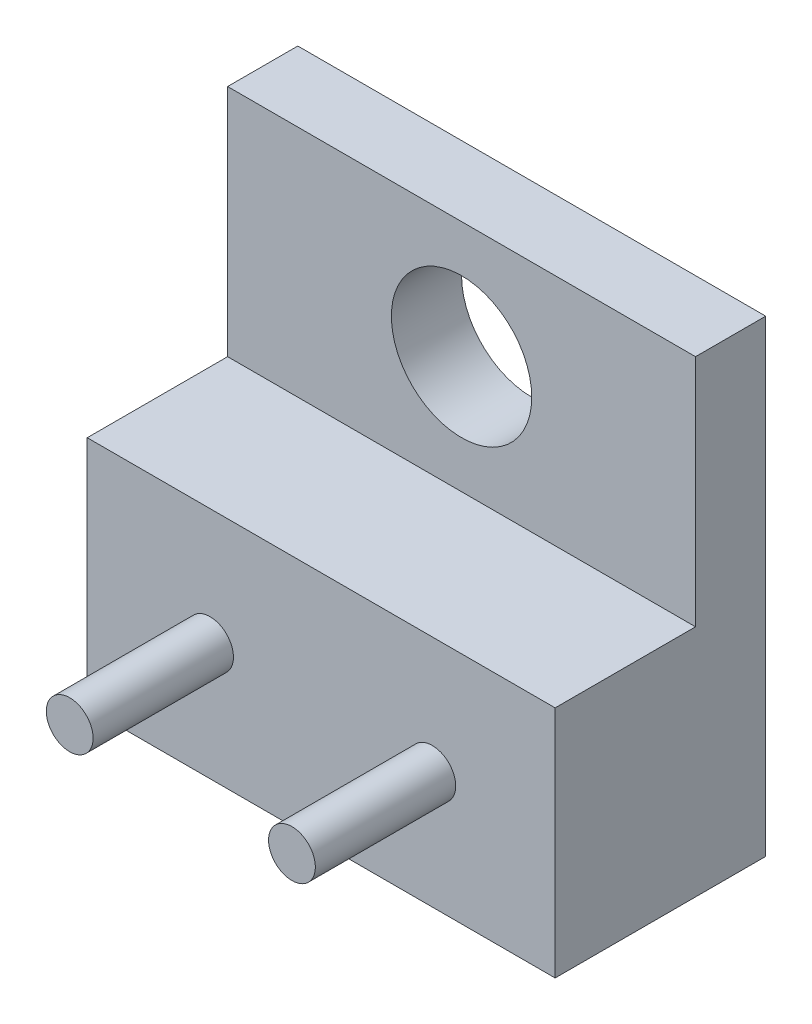
ISO-10303-21;
HEADER;
FILE_DESCRIPTION(('STEP AP214'),'2;1');
FILE_NAME('part.step','',(''),(''),'','','');
FILE_SCHEMA(('AUTOMOTIVE_DESIGN { 1 0 10303 214 1 1 1 1 }'));
ENDSEC;
DATA;
#1=APPLICATION_CONTEXT('core data for automotive mechanical design processes');
#2=APPLICATION_PROTOCOL_DEFINITION('international standard','automotive_design',2000,#1);
#3=PRODUCT_CONTEXT('',#1,'mechanical');
#4=PRODUCT('Part','Part','',(#3));
#5=PRODUCT_RELATED_PRODUCT_CATEGORY('part','',(#4));
#6=PRODUCT_DEFINITION_FORMATION('','',#4);
#7=PRODUCT_DEFINITION_CONTEXT('part definition',#1,'design');
#8=PRODUCT_DEFINITION('design','',#6,#7);
#9=PRODUCT_DEFINITION_SHAPE('','',#8);
#10=(LENGTH_UNIT() NAMED_UNIT(*) SI_UNIT(.MILLI.,.METRE.));
#11=(NAMED_UNIT(*) PLANE_ANGLE_UNIT() SI_UNIT($,.RADIAN.));
#12=(NAMED_UNIT(*) SI_UNIT($,.STERADIAN.) SOLID_ANGLE_UNIT());
#13=UNCERTAINTY_MEASURE_WITH_UNIT(LENGTH_MEASURE(1.E-05),#10,'distance_accuracy_value','');
#14=(GEOMETRIC_REPRESENTATION_CONTEXT(3) GLOBAL_UNCERTAINTY_ASSIGNED_CONTEXT((#13)) GLOBAL_UNIT_ASSIGNED_CONTEXT((#10,
#11,#12)) REPRESENTATION_CONTEXT('',''));
#15=CARTESIAN_POINT('',(0.,0.,0.));
#16=DIRECTION('',(0.,0.,1.));
#17=DIRECTION('',(1.,0.,0.));
#18=AXIS2_PLACEMENT_3D('',#15,#16,#17);
#19=CARTESIAN_POINT('',(0.,20.,9.));
#20=DIRECTION('',(0.,-1.,0.));
#21=DIRECTION('',(0.,0.,-1.));
#22=AXIS2_PLACEMENT_3D('',#19,#20,#21);
#23=PLANE('',#22);
#24=DIRECTION('',(-1.,0.,0.));
#25=VECTOR('',#24,1.);
#26=CARTESIAN_POINT('',(0.,20.,3.));
#27=LINE('',#26,#25);
#28=CARTESIAN_POINT('',(20.,20.,3.));
#29=VERTEX_POINT('',#28);
#30=CARTESIAN_POINT('',(0.,20.,3.));
#31=VERTEX_POINT('',#30);
#32=EDGE_CURVE('E174',#29,#31,#27,.T.);
#33=ORIENTED_EDGE('',*,*,#32,.F.);
#34=DIRECTION('',(0.,0.,-1.));
#35=VECTOR('',#34,1.);
#36=CARTESIAN_POINT('',(20.,20.,9.));
#37=LINE('',#36,#35);
#38=CARTESIAN_POINT('',(20.,20.,0.));
#39=VERTEX_POINT('',#38);
#40=EDGE_CURVE('E89',#29,#39,#37,.T.);
#41=ORIENTED_EDGE('',*,*,#40,.T.);
#42=DIRECTION('',(-1.,0.,0.));
#43=VECTOR('',#42,1.);
#44=CARTESIAN_POINT('',(0.,20.,0.));
#45=LINE('',#44,#43);
#46=CARTESIAN_POINT('',(0.,20.,0.));
#47=VERTEX_POINT('',#46);
#48=EDGE_CURVE('E93',#39,#47,#45,.T.);
#49=ORIENTED_EDGE('',*,*,#48,.T.);
#50=DIRECTION('',(0.,0.,-1.));
#51=VECTOR('',#50,1.);
#52=CARTESIAN_POINT('',(0.,20.,9.));
#53=LINE('',#52,#51);
#54=EDGE_CURVE('E79',#31,#47,#53,.T.);
#55=ORIENTED_EDGE('',*,*,#54,.F.);
#56=EDGE_LOOP('',(#33,#41,#49,#55));
#57=FACE_BOUND('',#56,.T.);
#58=ADVANCED_FACE('F35',(#57),#23,.F.);
#59=CARTESIAN_POINT('',(0.,0.,9.));
#60=DIRECTION('',(0.,0.,-1.));
#61=DIRECTION('',(-1.,0.,0.));
#62=AXIS2_PLACEMENT_3D('',#59,#60,#61);
#63=PLANE('',#62);
#64=CARTESIAN_POINT('',(5.25,5.,9.));
#65=DIRECTION('',(0.,0.,-1.));
#66=DIRECTION('',(-1.,0.,0.));
#67=AXIS2_PLACEMENT_3D('',#64,#65,#66);
#68=CIRCLE('',#67,1.);
#69=CARTESIAN_POINT('',(4.25,5.,9.));
#70=VERTEX_POINT('',#69);
#71=EDGE_CURVE('E43',#70,#70,#68,.F.);
#72=ORIENTED_EDGE('',*,*,#71,.F.);
#73=EDGE_LOOP('',(#72));
#74=FACE_BOUND('',#73,.T.);
#75=DIRECTION('',(0.,1.,0.));
#76=VECTOR('',#75,1.);
#77=CARTESIAN_POINT('',(20.,0.,9.));
#78=LINE('',#77,#76);
#79=CARTESIAN_POINT('',(20.,0.,9.));
#80=VERTEX_POINT('',#79);
#81=CARTESIAN_POINT('',(20.,10.,9.));
#82=VERTEX_POINT('',#81);
#83=EDGE_CURVE('E90',#80,#82,#78,.T.);
#84=ORIENTED_EDGE('',*,*,#83,.T.);
#85=DIRECTION('',(1.,0.,0.));
#86=VECTOR('',#85,1.);
#87=CARTESIAN_POINT('',(0.,10.,9.));
#88=LINE('',#87,#86);
#89=CARTESIAN_POINT('',(0.,10.,9.));
#90=VERTEX_POINT('',#89);
#91=EDGE_CURVE('E176',#90,#82,#88,.T.);
#92=ORIENTED_EDGE('',*,*,#91,.F.);
#93=DIRECTION('',(0.,-1.,0.));
#94=VECTOR('',#93,1.);
#95=CARTESIAN_POINT('',(0.,0.,9.));
#96=LINE('',#95,#94);
#97=CARTESIAN_POINT('',(0.,0.,9.));
#98=VERTEX_POINT('',#97);
#99=EDGE_CURVE('E98',#90,#98,#96,.T.);
#100=ORIENTED_EDGE('',*,*,#99,.T.);
#101=DIRECTION('',(1.,0.,0.));
#102=VECTOR('',#101,1.);
#103=CARTESIAN_POINT('',(0.,0.,9.));
#104=LINE('',#103,#102);
#105=EDGE_CURVE('E59',#98,#80,#104,.T.);
#106=ORIENTED_EDGE('',*,*,#105,.T.);
#107=EDGE_LOOP('',(#84,#92,#100,#106));
#108=FACE_BOUND('',#107,.T.);
#109=CARTESIAN_POINT('',(14.7499811048834,4.98105252368126,9.));
#110=DIRECTION('',(0.,0.,-1.));
#111=DIRECTION('',(-1.,0.,0.));
#112=AXIS2_PLACEMENT_3D('',#109,#110,#111);
#113=CIRCLE('',#112,1.);
#114=CARTESIAN_POINT('',(13.7499811048834,4.98105252368126,9.));
#115=VERTEX_POINT('',#114);
#116=EDGE_CURVE('E11',#115,#115,#113,.F.);
#117=ORIENTED_EDGE('',*,*,#116,.F.);
#118=EDGE_LOOP('',(#117));
#119=FACE_BOUND('',#118,.T.);
#120=ADVANCED_FACE('F124',(#74,#108,#119),#63,.F.);
#121=CARTESIAN_POINT('',(0.,0.,9.));
#122=DIRECTION('',(1.,0.,0.));
#123=DIRECTION('',(0.,0.,-1.));
#124=AXIS2_PLACEMENT_3D('',#121,#122,#123);
#125=PLANE('',#124);
#126=ORIENTED_EDGE('',*,*,#99,.F.);
#127=DIRECTION('',(0.,0.,1.));
#128=VECTOR('',#127,1.);
#129=CARTESIAN_POINT('',(0.,10.,3.));
#130=LINE('',#129,#128);
#131=CARTESIAN_POINT('',(0.,10.,3.));
#132=VERTEX_POINT('',#131);
#133=EDGE_CURVE('E171',#132,#90,#130,.T.);
#134=ORIENTED_EDGE('',*,*,#133,.F.);
#135=DIRECTION('',(0.,-1.,0.));
#136=VECTOR('',#135,1.);
#137=CARTESIAN_POINT('',(0.,20.,3.));
#138=LINE('',#137,#136);
#139=EDGE_CURVE('E87',#31,#132,#138,.T.);
#140=ORIENTED_EDGE('',*,*,#139,.F.);
#141=ORIENTED_EDGE('',*,*,#54,.T.);
#142=DIRECTION('',(0.,-1.,0.));
#143=VECTOR('',#142,1.);
#144=CARTESIAN_POINT('',(0.,0.,0.));
#145=LINE('',#144,#143);
#146=CARTESIAN_POINT('',(0.,0.,0.));
#147=VERTEX_POINT('',#146);
#148=EDGE_CURVE('E84',#47,#147,#145,.T.);
#149=ORIENTED_EDGE('',*,*,#148,.T.);
#150=DIRECTION('',(0.,0.,-1.));
#151=VECTOR('',#150,1.);
#152=CARTESIAN_POINT('',(0.,0.,9.));
#153=LINE('',#152,#151);
#154=EDGE_CURVE('E118',#98,#147,#153,.T.);
#155=ORIENTED_EDGE('',*,*,#154,.F.);
#156=EDGE_LOOP('',(#126,#134,#140,#141,#149,#155));
#157=FACE_BOUND('',#156,.T.);
#158=ADVANCED_FACE('F37',(#157),#125,.F.);
#159=CARTESIAN_POINT('',(0.,0.,9.));
#160=DIRECTION('',(0.,1.,0.));
#161=DIRECTION('',(0.,0.,1.));
#162=AXIS2_PLACEMENT_3D('',#159,#160,#161);
#163=PLANE('',#162);
#164=DIRECTION('',(1.,0.,0.));
#165=VECTOR('',#164,1.);
#166=CARTESIAN_POINT('',(0.,0.,0.));
#167=LINE('',#166,#165);
#168=CARTESIAN_POINT('',(20.,0.,0.));
#169=VERTEX_POINT('',#168);
#170=EDGE_CURVE('E102',#147,#169,#167,.T.);
#171=ORIENTED_EDGE('',*,*,#170,.T.);
#172=DIRECTION('',(0.,0.,-1.));
#173=VECTOR('',#172,1.);
#174=CARTESIAN_POINT('',(20.,0.,9.));
#175=LINE('',#174,#173);
#176=EDGE_CURVE('E115',#80,#169,#175,.T.);
#177=ORIENTED_EDGE('',*,*,#176,.F.);
#178=ORIENTED_EDGE('',*,*,#105,.F.);
#179=ORIENTED_EDGE('',*,*,#154,.T.);
#180=EDGE_LOOP('',(#171,#177,#178,#179));
#181=FACE_BOUND('',#180,.T.);
#182=ADVANCED_FACE('F157',(#181),#163,.F.);
#183=CARTESIAN_POINT('',(20.,0.,9.));
#184=DIRECTION('',(-1.,0.,0.));
#185=DIRECTION('',(0.,0.,1.));
#186=AXIS2_PLACEMENT_3D('',#183,#184,#185);
#187=PLANE('',#186);
#188=DIRECTION('',(0.,1.,0.));
#189=VECTOR('',#188,1.);
#190=CARTESIAN_POINT('',(20.,20.,3.));
#191=LINE('',#190,#189);
#192=CARTESIAN_POINT('',(20.,10.,3.));
#193=VERTEX_POINT('',#192);
#194=EDGE_CURVE('E50',#193,#29,#191,.T.);
#195=ORIENTED_EDGE('',*,*,#194,.F.);
#196=DIRECTION('',(0.,0.,1.));
#197=VECTOR('',#196,1.);
#198=CARTESIAN_POINT('',(20.,10.,3.));
#199=LINE('',#198,#197);
#200=EDGE_CURVE('E166',#193,#82,#199,.T.);
#201=ORIENTED_EDGE('',*,*,#200,.T.);
#202=ORIENTED_EDGE('',*,*,#83,.F.);
#203=ORIENTED_EDGE('',*,*,#176,.T.);
#204=DIRECTION('',(0.,1.,0.));
#205=VECTOR('',#204,1.);
#206=CARTESIAN_POINT('',(20.,0.,0.));
#207=LINE('',#206,#205);
#208=EDGE_CURVE('E99',#169,#39,#207,.T.);
#209=ORIENTED_EDGE('',*,*,#208,.T.);
#210=ORIENTED_EDGE('',*,*,#40,.F.);
#211=EDGE_LOOP('',(#195,#201,#202,#203,#209,#210));
#212=FACE_BOUND('',#211,.T.);
#213=ADVANCED_FACE('F155',(#212),#187,.F.);
#214=CARTESIAN_POINT('',(0.,0.,0.));
#215=DIRECTION('',(0.,0.,-1.));
#216=DIRECTION('',(-1.,0.,0.));
#217=AXIS2_PLACEMENT_3D('',#214,#215,#216);
#218=PLANE('',#217);
#219=CARTESIAN_POINT('',(10.,15.,0.));
#220=DIRECTION('',(0.,0.,-1.));
#221=DIRECTION('',(-1.,0.,0.));
#222=AXIS2_PLACEMENT_3D('',#219,#220,#221);
#223=CIRCLE('',#222,3.);
#224=CARTESIAN_POINT('',(7.,15.,0.));
#225=VERTEX_POINT('',#224);
#226=EDGE_CURVE('E185',#225,#225,#223,.F.);
#227=ORIENTED_EDGE('',*,*,#226,.T.);
#228=EDGE_LOOP('',(#227));
#229=FACE_BOUND('',#228,.T.);
#230=ORIENTED_EDGE('',*,*,#148,.F.);
#231=ORIENTED_EDGE('',*,*,#48,.F.);
#232=ORIENTED_EDGE('',*,*,#208,.F.);
#233=ORIENTED_EDGE('',*,*,#170,.F.);
#234=EDGE_LOOP('',(#230,#231,#232,#233));
#235=FACE_BOUND('',#234,.T.);
#236=ADVANCED_FACE('F101',(#229,#235),#218,.T.);
#237=CARTESIAN_POINT('',(5.25,5.,15.));
#238=DIRECTION('',(0.,0.,-1.));
#239=DIRECTION('',(-1.,0.,0.));
#240=AXIS2_PLACEMENT_3D('',#237,#238,#239);
#241=CYLINDRICAL_SURFACE('',#240,1.);
#242=CARTESIAN_POINT('',(5.25,5.,15.));
#243=DIRECTION('',(0.,0.,1.));
#244=DIRECTION('',(1.,0.,0.));
#245=AXIS2_PLACEMENT_3D('',#242,#243,#244);
#246=CIRCLE('',#245,1.);
#247=CARTESIAN_POINT('',(6.25,5.,15.));
#248=VERTEX_POINT('',#247);
#249=EDGE_CURVE('E104',#248,#248,#246,.T.);
#250=ORIENTED_EDGE('',*,*,#249,.F.);
#251=EDGE_LOOP('',(#250));
#252=FACE_BOUND('',#251,.T.);
#253=ORIENTED_EDGE('',*,*,#71,.T.);
#254=EDGE_LOOP('',(#253));
#255=FACE_BOUND('',#254,.T.);
#256=ADVANCED_FACE('F122',(#252,#255),#241,.T.);
#257=CARTESIAN_POINT('',(5.25,5.,15.));
#258=DIRECTION('',(0.,0.,1.));
#259=DIRECTION('',(1.,0.,0.));
#260=AXIS2_PLACEMENT_3D('',#257,#258,#259);
#261=PLANE('',#260);
#262=ORIENTED_EDGE('',*,*,#249,.T.);
#263=EDGE_LOOP('',(#262));
#264=FACE_BOUND('',#263,.T.);
#265=ADVANCED_FACE('F136',(#264),#261,.T.);
#266=CARTESIAN_POINT('',(14.7499811048834,4.98105252368126,15.));
#267=DIRECTION('',(0.,0.,-1.));
#268=DIRECTION('',(-1.,0.,0.));
#269=AXIS2_PLACEMENT_3D('',#266,#267,#268);
#270=CYLINDRICAL_SURFACE('',#269,1.);
#271=CARTESIAN_POINT('',(14.7499811048834,4.98105252368126,15.));
#272=DIRECTION('',(0.,0.,1.));
#273=DIRECTION('',(1.,0.,0.));
#274=AXIS2_PLACEMENT_3D('',#271,#272,#273);
#275=CIRCLE('',#274,1.);
#276=CARTESIAN_POINT('',(15.7499811048834,4.98105252368126,15.));
#277=VERTEX_POINT('',#276);
#278=EDGE_CURVE('E108',#277,#277,#275,.T.);
#279=ORIENTED_EDGE('',*,*,#278,.F.);
#280=EDGE_LOOP('',(#279));
#281=FACE_BOUND('',#280,.T.);
#282=ORIENTED_EDGE('',*,*,#116,.T.);
#283=EDGE_LOOP('',(#282));
#284=FACE_BOUND('',#283,.T.);
#285=ADVANCED_FACE('F133',(#281,#284),#270,.T.);
#286=CARTESIAN_POINT('',(14.7499811048834,4.98105252368126,15.));
#287=DIRECTION('',(0.,0.,1.));
#288=DIRECTION('',(1.,0.,0.));
#289=AXIS2_PLACEMENT_3D('',#286,#287,#288);
#290=PLANE('',#289);
#291=ORIENTED_EDGE('',*,*,#278,.T.);
#292=EDGE_LOOP('',(#291));
#293=FACE_BOUND('',#292,.T.);
#294=ADVANCED_FACE('F135',(#293),#290,.T.);
#295=CARTESIAN_POINT('',(0.,10.,3.));
#296=DIRECTION('',(0.,-1.,0.));
#297=DIRECTION('',(0.,0.,-1.));
#298=AXIS2_PLACEMENT_3D('',#295,#296,#297);
#299=PLANE('',#298);
#300=ORIENTED_EDGE('',*,*,#91,.T.);
#301=ORIENTED_EDGE('',*,*,#200,.F.);
#302=DIRECTION('',(1.,0.,0.));
#303=VECTOR('',#302,1.);
#304=CARTESIAN_POINT('',(0.,10.,3.));
#305=LINE('',#304,#303);
#306=EDGE_CURVE('E182',#132,#193,#305,.T.);
#307=ORIENTED_EDGE('',*,*,#306,.F.);
#308=ORIENTED_EDGE('',*,*,#133,.T.);
#309=EDGE_LOOP('',(#300,#301,#307,#308));
#310=FACE_BOUND('',#309,.T.);
#311=ADVANCED_FACE('F143',(#310),#299,.F.);
#312=CARTESIAN_POINT('',(0.,0.,3.));
#313=DIRECTION('',(0.,0.,1.));
#314=DIRECTION('',(1.,0.,0.));
#315=AXIS2_PLACEMENT_3D('',#312,#313,#314);
#316=PLANE('',#315);
#317=CARTESIAN_POINT('',(10.,15.,3.));
#318=DIRECTION('',(0.,0.,1.));
#319=DIRECTION('',(1.,0.,0.));
#320=AXIS2_PLACEMENT_3D('',#317,#318,#319);
#321=CIRCLE('',#320,3.);
#322=CARTESIAN_POINT('',(13.,15.,3.));
#323=VERTEX_POINT('',#322);
#324=EDGE_CURVE('E179',#323,#323,#321,.T.);
#325=ORIENTED_EDGE('',*,*,#324,.F.);
#326=EDGE_LOOP('',(#325));
#327=FACE_BOUND('',#326,.T.);
#328=ORIENTED_EDGE('',*,*,#139,.T.);
#329=ORIENTED_EDGE('',*,*,#306,.T.);
#330=ORIENTED_EDGE('',*,*,#194,.T.);
#331=ORIENTED_EDGE('',*,*,#32,.T.);
#332=EDGE_LOOP('',(#328,#329,#330,#331));
#333=FACE_BOUND('',#332,.T.);
#334=ADVANCED_FACE('F193',(#327,#333),#316,.T.);
#335=CARTESIAN_POINT('',(10.,15.,-0.00100000000000013));
#336=DIRECTION('',(0.,0.,1.));
#337=DIRECTION('',(1.,0.,0.));
#338=AXIS2_PLACEMENT_3D('',#335,#336,#337);
#339=CYLINDRICAL_SURFACE('',#338,3.);
#340=ORIENTED_EDGE('',*,*,#226,.F.);
#341=EDGE_LOOP('',(#340));
#342=FACE_BOUND('',#341,.T.);
#343=ORIENTED_EDGE('',*,*,#324,.T.);
#344=EDGE_LOOP('',(#343));
#345=FACE_BOUND('',#344,.T.);
#346=ADVANCED_FACE('F191',(#342,#345),#339,.F.);
#347=CLOSED_SHELL('',(#58,#120,#158,#182,#213,#236,#256,#265,#285,#294,#311,#334,#346));
#348=MANIFOLD_SOLID_BREP('B2',#347);
#349=ADVANCED_BREP_SHAPE_REPRESENTATION('',(#18,#348),#14);
#350=SHAPE_DEFINITION_REPRESENTATION(#9,#349);
ENDSEC;
END-ISO-10303-21;
